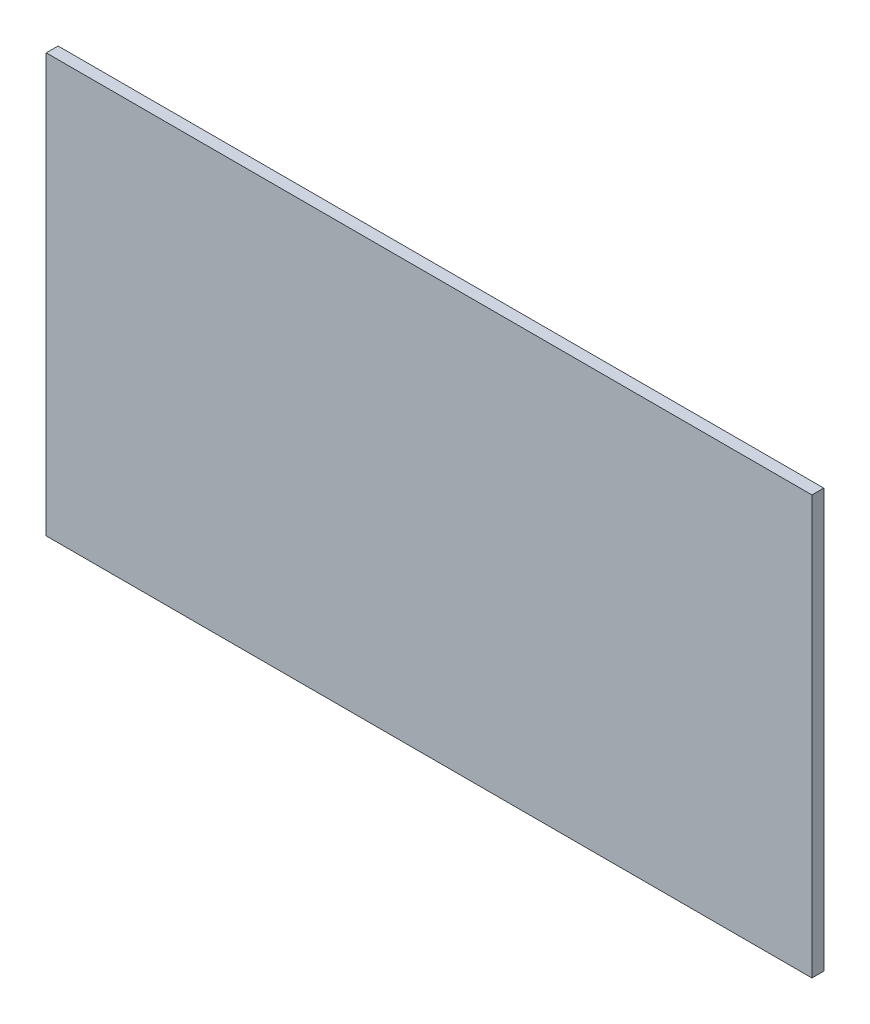
ISO-10303-21;
HEADER;
FILE_DESCRIPTION(('STEP AP214'),'2;1');
FILE_NAME('part.step','',(''),(''),'','','');
FILE_SCHEMA(('AUTOMOTIVE_DESIGN { 1 0 10303 214 1 1 1 1 }'));
ENDSEC;
DATA;
#1=APPLICATION_CONTEXT('core data for automotive mechanical design processes');
#2=APPLICATION_PROTOCOL_DEFINITION('international standard','automotive_design',2000,#1);
#3=PRODUCT_CONTEXT('',#1,'mechanical');
#4=PRODUCT('Part','Part','',(#3));
#5=PRODUCT_RELATED_PRODUCT_CATEGORY('part','',(#4));
#6=PRODUCT_DEFINITION_FORMATION('','',#4);
#7=PRODUCT_DEFINITION_CONTEXT('part definition',#1,'design');
#8=PRODUCT_DEFINITION('design','',#6,#7);
#9=PRODUCT_DEFINITION_SHAPE('','',#8);
#10=(LENGTH_UNIT() NAMED_UNIT(*) SI_UNIT(.MILLI.,.METRE.));
#11=(NAMED_UNIT(*) PLANE_ANGLE_UNIT() SI_UNIT($,.RADIAN.));
#12=(NAMED_UNIT(*) SI_UNIT($,.STERADIAN.) SOLID_ANGLE_UNIT());
#13=UNCERTAINTY_MEASURE_WITH_UNIT(LENGTH_MEASURE(1.E-05),#10,'distance_accuracy_value','');
#14=(GEOMETRIC_REPRESENTATION_CONTEXT(3) GLOBAL_UNCERTAINTY_ASSIGNED_CONTEXT((#13)) GLOBAL_UNIT_ASSIGNED_CONTEXT((#10,
#11,#12)) REPRESENTATION_CONTEXT('',''));
#15=CARTESIAN_POINT('',(0.,0.,0.));
#16=DIRECTION('',(0.,0.,1.));
#17=DIRECTION('',(1.,0.,0.));
#18=AXIS2_PLACEMENT_3D('',#15,#16,#17);
#19=CARTESIAN_POINT('',(0.,0.,3.));
#20=DIRECTION('',(1.,0.,0.));
#21=DIRECTION('',(0.,0.,-1.));
#22=AXIS2_PLACEMENT_3D('',#19,#20,#21);
#23=PLANE('',#22);
#24=DIRECTION('',(0.,-1.,0.));
#25=VECTOR('',#24,1.);
#26=CARTESIAN_POINT('',(0.,0.,0.));
#27=LINE('',#26,#25);
#28=CARTESIAN_POINT('',(0.,106.,0.));
#29=VERTEX_POINT('',#28);
#30=CARTESIAN_POINT('',(0.,0.,0.));
#31=VERTEX_POINT('',#30);
#32=EDGE_CURVE('E105',#29,#31,#27,.T.);
#33=ORIENTED_EDGE('',*,*,#32,.T.);
#34=DIRECTION('',(0.,0.,-1.));
#35=VECTOR('',#34,1.);
#36=CARTESIAN_POINT('',(0.,0.,3.));
#37=LINE('',#36,#35);
#38=CARTESIAN_POINT('',(0.,0.,3.));
#39=VERTEX_POINT('',#38);
#40=EDGE_CURVE('E11',#39,#31,#37,.T.);
#41=ORIENTED_EDGE('',*,*,#40,.F.);
#42=DIRECTION('',(0.,-1.,0.));
#43=VECTOR('',#42,1.);
#44=CARTESIAN_POINT('',(0.,0.,3.));
#45=LINE('',#44,#43);
#46=CARTESIAN_POINT('',(0.,106.,3.));
#47=VERTEX_POINT('',#46);
#48=EDGE_CURVE('E89',#47,#39,#45,.T.);
#49=ORIENTED_EDGE('',*,*,#48,.F.);
#50=DIRECTION('',(0.,0.,-1.));
#51=VECTOR('',#50,1.);
#52=CARTESIAN_POINT('',(0.,106.,3.));
#53=LINE('',#52,#51);
#54=EDGE_CURVE('E97',#47,#29,#53,.T.);
#55=ORIENTED_EDGE('',*,*,#54,.T.);
#56=EDGE_LOOP('',(#33,#41,#49,#55));
#57=FACE_BOUND('',#56,.T.);
#58=ADVANCED_FACE('F39',(#57),#23,.F.);
#59=CARTESIAN_POINT('',(0.,0.,3.));
#60=DIRECTION('',(0.,1.,0.));
#61=DIRECTION('',(0.,0.,1.));
#62=AXIS2_PLACEMENT_3D('',#59,#60,#61);
#63=PLANE('',#62);
#64=DIRECTION('',(1.,0.,0.));
#65=VECTOR('',#64,1.);
#66=CARTESIAN_POINT('',(0.,0.,0.));
#67=LINE('',#66,#65);
#68=CARTESIAN_POINT('',(194.,0.,0.));
#69=VERTEX_POINT('',#68);
#70=EDGE_CURVE('E92',#31,#69,#67,.T.);
#71=ORIENTED_EDGE('',*,*,#70,.T.);
#72=DIRECTION('',(0.,0.,-1.));
#73=VECTOR('',#72,1.);
#74=CARTESIAN_POINT('',(194.,0.,3.));
#75=LINE('',#74,#73);
#76=CARTESIAN_POINT('',(194.,0.,3.));
#77=VERTEX_POINT('',#76);
#78=EDGE_CURVE('E50',#77,#69,#75,.T.);
#79=ORIENTED_EDGE('',*,*,#78,.F.);
#80=DIRECTION('',(1.,0.,0.));
#81=VECTOR('',#80,1.);
#82=CARTESIAN_POINT('',(0.,0.,3.));
#83=LINE('',#82,#81);
#84=EDGE_CURVE('E82',#39,#77,#83,.T.);
#85=ORIENTED_EDGE('',*,*,#84,.F.);
#86=ORIENTED_EDGE('',*,*,#40,.T.);
#87=EDGE_LOOP('',(#71,#79,#85,#86));
#88=FACE_BOUND('',#87,.T.);
#89=ADVANCED_FACE('F93',(#88),#63,.F.);
#90=CARTESIAN_POINT('',(194.,0.,3.));
#91=DIRECTION('',(-1.,0.,0.));
#92=DIRECTION('',(0.,0.,1.));
#93=AXIS2_PLACEMENT_3D('',#90,#91,#92);
#94=PLANE('',#93);
#95=DIRECTION('',(0.,1.,0.));
#96=VECTOR('',#95,1.);
#97=CARTESIAN_POINT('',(194.,0.,0.));
#98=LINE('',#97,#96);
#99=CARTESIAN_POINT('',(194.,106.,0.));
#100=VERTEX_POINT('',#99);
#101=EDGE_CURVE('E72',#69,#100,#98,.T.);
#102=ORIENTED_EDGE('',*,*,#101,.T.);
#103=DIRECTION('',(0.,0.,-1.));
#104=VECTOR('',#103,1.);
#105=CARTESIAN_POINT('',(194.,106.,3.));
#106=LINE('',#105,#104);
#107=CARTESIAN_POINT('',(194.,106.,3.));
#108=VERTEX_POINT('',#107);
#109=EDGE_CURVE('E94',#108,#100,#106,.T.);
#110=ORIENTED_EDGE('',*,*,#109,.F.);
#111=DIRECTION('',(0.,1.,0.));
#112=VECTOR('',#111,1.);
#113=CARTESIAN_POINT('',(194.,0.,3.));
#114=LINE('',#113,#112);
#115=EDGE_CURVE('E88',#77,#108,#114,.T.);
#116=ORIENTED_EDGE('',*,*,#115,.F.);
#117=ORIENTED_EDGE('',*,*,#78,.T.);
#118=EDGE_LOOP('',(#102,#110,#116,#117));
#119=FACE_BOUND('',#118,.T.);
#120=ADVANCED_FACE('F96',(#119),#94,.F.);
#121=CARTESIAN_POINT('',(0.,106.,3.));
#122=DIRECTION('',(0.,-1.,0.));
#123=DIRECTION('',(0.,0.,-1.));
#124=AXIS2_PLACEMENT_3D('',#121,#122,#123);
#125=PLANE('',#124);
#126=DIRECTION('',(-1.,0.,0.));
#127=VECTOR('',#126,1.);
#128=CARTESIAN_POINT('',(0.,106.,0.));
#129=LINE('',#128,#127);
#130=EDGE_CURVE('E76',#100,#29,#129,.T.);
#131=ORIENTED_EDGE('',*,*,#130,.T.);
#132=ORIENTED_EDGE('',*,*,#54,.F.);
#133=DIRECTION('',(-1.,0.,0.));
#134=VECTOR('',#133,1.);
#135=CARTESIAN_POINT('',(0.,106.,3.));
#136=LINE('',#135,#134);
#137=EDGE_CURVE('E54',#108,#47,#136,.T.);
#138=ORIENTED_EDGE('',*,*,#137,.F.);
#139=ORIENTED_EDGE('',*,*,#109,.T.);
#140=EDGE_LOOP('',(#131,#132,#138,#139));
#141=FACE_BOUND('',#140,.T.);
#142=ADVANCED_FACE('F108',(#141),#125,.F.);
#143=CARTESIAN_POINT('',(0.,0.,3.));
#144=DIRECTION('',(0.,0.,-1.));
#145=DIRECTION('',(-1.,0.,0.));
#146=AXIS2_PLACEMENT_3D('',#143,#144,#145);
#147=PLANE('',#146);
#148=ORIENTED_EDGE('',*,*,#48,.T.);
#149=ORIENTED_EDGE('',*,*,#84,.T.);
#150=ORIENTED_EDGE('',*,*,#115,.T.);
#151=ORIENTED_EDGE('',*,*,#137,.T.);
#152=EDGE_LOOP('',(#148,#149,#150,#151));
#153=FACE_BOUND('',#152,.T.);
#154=ADVANCED_FACE('F86',(#153),#147,.F.);
#155=CARTESIAN_POINT('',(0.,0.,0.));
#156=DIRECTION('',(0.,0.,-1.));
#157=DIRECTION('',(-1.,0.,0.));
#158=AXIS2_PLACEMENT_3D('',#155,#156,#157);
#159=PLANE('',#158);
#160=ORIENTED_EDGE('',*,*,#32,.F.);
#161=ORIENTED_EDGE('',*,*,#130,.F.);
#162=ORIENTED_EDGE('',*,*,#101,.F.);
#163=ORIENTED_EDGE('',*,*,#70,.F.);
#164=EDGE_LOOP('',(#160,#161,#162,#163));
#165=FACE_BOUND('',#164,.T.);
#166=ADVANCED_FACE('F115',(#165),#159,.T.);
#167=CLOSED_SHELL('',(#58,#89,#120,#142,#154,#166));
#168=MANIFOLD_SOLID_BREP('B2',#167);
#169=ADVANCED_BREP_SHAPE_REPRESENTATION('',(#18,#168),#14);
#170=SHAPE_DEFINITION_REPRESENTATION(#9,#169);
ENDSEC;
END-ISO-10303-21;
